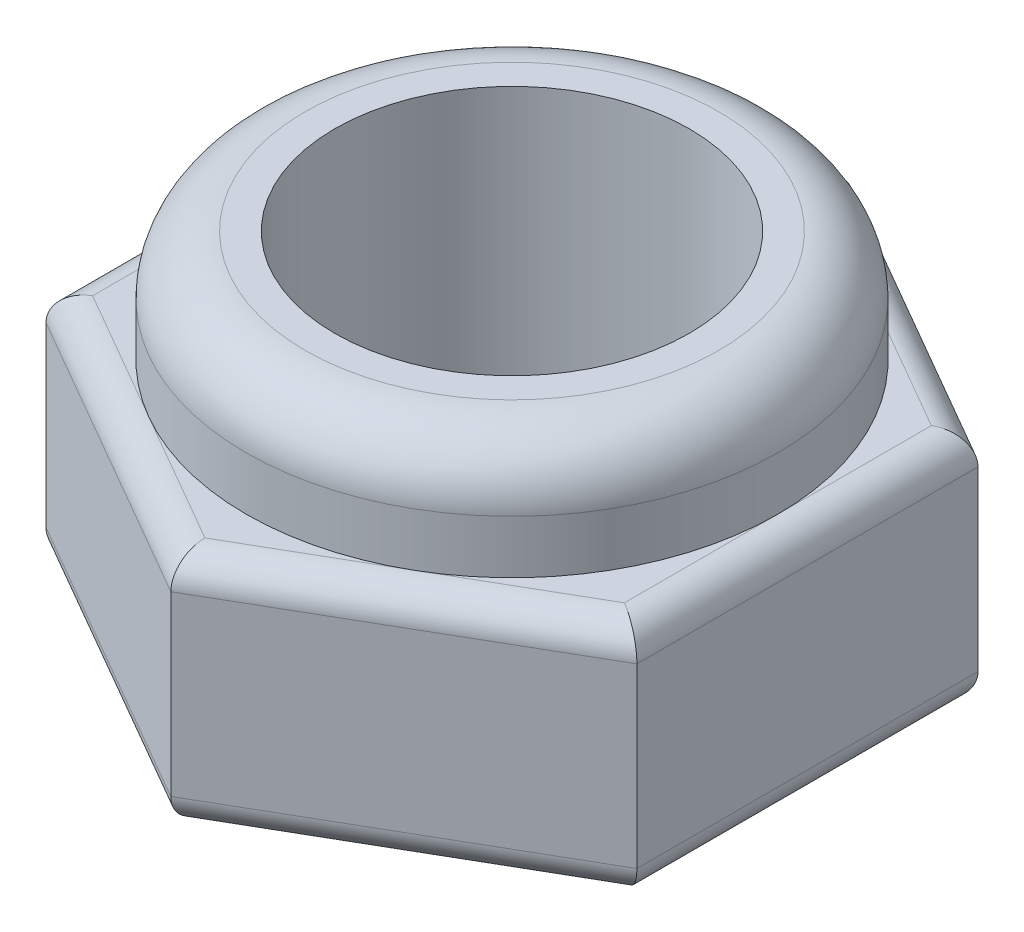
ISO-10303-21;
HEADER;
FILE_DESCRIPTION(('STEP AP214'),'2;1');
FILE_NAME('part.step','',(''),(''),'','','');
FILE_SCHEMA(('AUTOMOTIVE_DESIGN { 1 0 10303 214 1 1 1 1 }'));
ENDSEC;
DATA;
#1=APPLICATION_CONTEXT('core data for automotive mechanical design processes');
#2=APPLICATION_PROTOCOL_DEFINITION('international standard','automotive_design',2000,#1);
#3=PRODUCT_CONTEXT('',#1,'mechanical');
#4=PRODUCT('Part','Part','',(#3));
#5=PRODUCT_RELATED_PRODUCT_CATEGORY('part','',(#4));
#6=PRODUCT_DEFINITION_FORMATION('','',#4);
#7=PRODUCT_DEFINITION_CONTEXT('part definition',#1,'design');
#8=PRODUCT_DEFINITION('design','',#6,#7);
#9=PRODUCT_DEFINITION_SHAPE('','',#8);
#10=(LENGTH_UNIT() NAMED_UNIT(*) SI_UNIT(.MILLI.,.METRE.));
#11=(NAMED_UNIT(*) PLANE_ANGLE_UNIT() SI_UNIT($,.RADIAN.));
#12=(NAMED_UNIT(*) SI_UNIT($,.STERADIAN.) SOLID_ANGLE_UNIT());
#13=UNCERTAINTY_MEASURE_WITH_UNIT(LENGTH_MEASURE(1.E-05),#10,'distance_accuracy_value','');
#14=(GEOMETRIC_REPRESENTATION_CONTEXT(3) GLOBAL_UNCERTAINTY_ASSIGNED_CONTEXT((#13)) GLOBAL_UNIT_ASSIGNED_CONTEXT((#10,
#11,#12)) REPRESENTATION_CONTEXT('',''));
#15=CARTESIAN_POINT('',(0.,0.,0.));
#16=DIRECTION('',(0.,0.,1.));
#17=DIRECTION('',(1.,0.,0.));
#18=AXIS2_PLACEMENT_3D('',#15,#16,#17);
#19=CARTESIAN_POINT('',(0.,4.,0.));
#20=DIRECTION('',(0.,1.,0.));
#21=DIRECTION('',(0.,0.,1.));
#22=AXIS2_PLACEMENT_3D('',#19,#20,#21);
#23=PLANE('',#22);
#24=DIRECTION('',(0.866025403784438,0.,-0.500000000000001));
#25=VECTOR('',#24,1.);
#26=CARTESIAN_POINT('',(4.75000000000001,4.,2.4537386440559));
#27=LINE('',#26,#25);
#28=CARTESIAN_POINT('',(2.25000000000001,4.,3.89711431702997));
#29=VERTEX_POINT('',#28);
#30=CARTESIAN_POINT('',(4.50000000000001,4.,2.59807621135331));
#31=VERTEX_POINT('',#30);
#32=EDGE_CURVE('E55',#29,#31,#27,.T.);
#33=ORIENTED_EDGE('',*,*,#32,.T.);
#34=DIRECTION('',(0.,0.,-1.));
#35=VECTOR('',#34,1.);
#36=CARTESIAN_POINT('',(4.49999999999999,4.,-2.88675134594815));
#37=LINE('',#36,#35);
#38=CARTESIAN_POINT('',(4.5,4.,0.));
#39=VERTEX_POINT('',#38);
#40=EDGE_CURVE('E11',#31,#39,#37,.T.);
#41=ORIENTED_EDGE('',*,*,#40,.T.);
#42=CARTESIAN_POINT('',(0.,4.,0.));
#43=DIRECTION('',(0.,1.,0.));
#44=DIRECTION('',(0.,0.,1.));
#45=AXIS2_PLACEMENT_3D('',#42,#43,#44);
#46=CIRCLE('',#45,4.5);
#47=EDGE_CURVE('E269',#29,#39,#46,.T.);
#48=ORIENTED_EDGE('',*,*,#47,.F.);
#49=EDGE_LOOP('',(#33,#41,#48));
#50=FACE_BOUND('',#49,.T.);
#51=ADVANCED_FACE('F39',(#50),#23,.T.);
#52=CARTESIAN_POINT('',(2.24999999999998,4.,-3.89711431702999));
#53=VERTEX_POINT('',#52);
#54=EDGE_CURVE('E285',#39,#53,#46,.T.);
#55=ORIENTED_EDGE('',*,*,#54,.F.);
#56=DIRECTION('',(0.,0.,-1.));
#57=VECTOR('',#56,1.);
#58=CARTESIAN_POINT('',(4.49999999999999,4.,-2.88675134594815));
#59=LINE('',#58,#57);
#60=CARTESIAN_POINT('',(4.49999999999999,4.,-2.59807621135334));
#61=VERTEX_POINT('',#60);
#62=EDGE_CURVE('E48',#39,#61,#59,.T.);
#63=ORIENTED_EDGE('',*,*,#62,.T.);
#64=DIRECTION('',(-0.866025403784442,0.,-0.499999999999995));
#65=VECTOR('',#64,1.);
#66=CARTESIAN_POINT('',(-0.250000000000038,4.,-5.34048999000404));
#67=LINE('',#66,#65);
#68=EDGE_CURVE('E214',#61,#53,#67,.T.);
#69=ORIENTED_EDGE('',*,*,#68,.T.);
#70=EDGE_LOOP('',(#55,#63,#69));
#71=FACE_BOUND('',#70,.T.);
#72=ADVANCED_FACE('F309',(#71),#23,.T.);
#73=CARTESIAN_POINT('',(-2.25000000000003,4.,-3.89711431702996));
#74=VERTEX_POINT('',#73);
#75=EDGE_CURVE('E349',#53,#74,#46,.T.);
#76=ORIENTED_EDGE('',*,*,#75,.F.);
#77=DIRECTION('',(-0.866025403784442,0.,-0.499999999999995));
#78=VECTOR('',#77,1.);
#79=CARTESIAN_POINT('',(-0.250000000000038,4.,-5.34048999000404));
#80=LINE('',#79,#78);
#81=CARTESIAN_POINT('',(0.,4.,-5.19615242270664));
#82=VERTEX_POINT('',#81);
#83=EDGE_CURVE('E216',#53,#82,#80,.T.);
#84=ORIENTED_EDGE('',*,*,#83,.T.);
#85=DIRECTION('',(-0.866025403784435,0.,0.500000000000007));
#86=VECTOR('',#85,1.);
#87=CARTESIAN_POINT('',(-4.75000000000003,4.,-2.45373864405587));
#88=LINE('',#87,#86);
#89=EDGE_CURVE('E222',#82,#74,#88,.T.);
#90=ORIENTED_EDGE('',*,*,#89,.T.);
#91=EDGE_LOOP('',(#76,#84,#90));
#92=FACE_BOUND('',#91,.T.);
#93=ADVANCED_FACE('F315',(#92),#23,.T.);
#94=DIRECTION('',(0.866025403784442,0.,0.499999999999995));
#95=VECTOR('',#94,1.);
#96=CARTESIAN_POINT('',(0.249999999999999,4.,5.34048999000404));
#97=LINE('',#96,#95);
#98=CARTESIAN_POINT('',(-2.24999999999999,4.,3.89711431703001));
#99=VERTEX_POINT('',#98);
#100=CARTESIAN_POINT('',(0.,4.,5.19615242270664));
#101=VERTEX_POINT('',#100);
#102=EDGE_CURVE('E220',#99,#101,#97,.T.);
#103=ORIENTED_EDGE('',*,*,#102,.T.);
#104=DIRECTION('',(0.866025403784438,0.,-0.500000000000001));
#105=VECTOR('',#104,1.);
#106=CARTESIAN_POINT('',(4.75000000000001,4.,2.4537386440559));
#107=LINE('',#106,#105);
#108=EDGE_CURVE('E218',#101,#29,#107,.T.);
#109=ORIENTED_EDGE('',*,*,#108,.T.);
#110=EDGE_CURVE('E270',#99,#29,#46,.T.);
#111=ORIENTED_EDGE('',*,*,#110,.F.);
#112=EDGE_LOOP('',(#103,#109,#111));
#113=FACE_BOUND('',#112,.T.);
#114=ADVANCED_FACE('F331',(#113),#23,.T.);
#115=CARTESIAN_POINT('',(-4.5,4.,0.));
#116=VERTEX_POINT('',#115);
#117=EDGE_CURVE('E342',#74,#116,#46,.T.);
#118=ORIENTED_EDGE('',*,*,#117,.F.);
#119=DIRECTION('',(-0.866025403784435,0.,0.500000000000007));
#120=VECTOR('',#119,1.);
#121=CARTESIAN_POINT('',(-4.75000000000003,4.,-2.45373864405587));
#122=LINE('',#121,#120);
#123=CARTESIAN_POINT('',(-4.50000000000003,4.,-2.59807621135328));
#124=VERTEX_POINT('',#123);
#125=EDGE_CURVE('E225',#74,#124,#122,.T.);
#126=ORIENTED_EDGE('',*,*,#125,.T.);
#127=DIRECTION('',(0.,0.,1.));
#128=VECTOR('',#127,1.);
#129=CARTESIAN_POINT('',(-4.49999999999997,4.,2.88675134594818));
#130=LINE('',#129,#128);
#131=EDGE_CURVE('E229',#124,#116,#130,.T.);
#132=ORIENTED_EDGE('',*,*,#131,.T.);
#133=EDGE_LOOP('',(#118,#126,#132));
#134=FACE_BOUND('',#133,.T.);
#135=ADVANCED_FACE('F320',(#134),#23,.T.);
#136=CARTESIAN_POINT('',(-4.99999999999997,4.,2.88675134594819));
#137=DIRECTION('',(0.499999999999995,0.,-0.866025403784441));
#138=DIRECTION('',(-0.866025403784442,0.,-0.499999999999995));
#139=AXIS2_PLACEMENT_3D('',#136,#137,#138);
#140=PLANE('',#139);
#141=DIRECTION('',(0.,-1.,0.));
#142=VECTOR('',#141,1.);
#143=CARTESIAN_POINT('',(-4.99999999999997,4.,2.88675134594819));
#144=LINE('',#143,#142);
#145=CARTESIAN_POINT('',(-4.99999999999997,3.5,2.88675134594819));
#146=VERTEX_POINT('',#145);
#147=CARTESIAN_POINT('',(-4.99999999999997,0.5,2.88675134594819));
#148=VERTEX_POINT('',#147);
#149=EDGE_CURVE('E279',#146,#148,#144,.T.);
#150=ORIENTED_EDGE('',*,*,#149,.T.);
#151=DIRECTION('',(0.866025403784442,0.,0.499999999999995));
#152=VECTOR('',#151,1.);
#153=CARTESIAN_POINT('',(-4.99999999999997,0.5,2.88675134594819));
#154=LINE('',#153,#152);
#155=CARTESIAN_POINT('',(0.,0.5,5.77350269189626));
#156=VERTEX_POINT('',#155);
#157=EDGE_CURVE('E233',#148,#156,#154,.T.);
#158=ORIENTED_EDGE('',*,*,#157,.T.);
#159=DIRECTION('',(0.,-1.,0.));
#160=VECTOR('',#159,1.);
#161=CARTESIAN_POINT('',(0.,4.,5.77350269189626));
#162=LINE('',#161,#160);
#163=CARTESIAN_POINT('',(0.,3.5,5.77350269189626));
#164=VERTEX_POINT('',#163);
#165=EDGE_CURVE('E170',#164,#156,#162,.T.);
#166=ORIENTED_EDGE('',*,*,#165,.F.);
#167=DIRECTION('',(0.866025403784442,0.,0.499999999999995));
#168=VECTOR('',#167,1.);
#169=CARTESIAN_POINT('',(-4.99999999999997,3.5,2.88675134594819));
#170=LINE('',#169,#168);
#171=EDGE_CURVE('E235',#164,#146,#170,.F.);
#172=ORIENTED_EDGE('',*,*,#171,.T.);
#173=EDGE_LOOP('',(#150,#158,#166,#172));
#174=FACE_BOUND('',#173,.T.);
#175=ADVANCED_FACE('F330',(#174),#140,.F.);
#176=CARTESIAN_POINT('',(0.,4.,5.77350269189626));
#177=DIRECTION('',(-0.500000000000001,0.,-0.866025403784438));
#178=DIRECTION('',(-0.866025403784438,0.,0.500000000000001));
#179=AXIS2_PLACEMENT_3D('',#176,#177,#178);
#180=PLANE('',#179);
#181=ORIENTED_EDGE('',*,*,#165,.T.);
#182=DIRECTION('',(0.866025403784438,0.,-0.500000000000001));
#183=VECTOR('',#182,1.);
#184=CARTESIAN_POINT('',(0.,0.5,5.77350269189626));
#185=LINE('',#184,#183);
#186=CARTESIAN_POINT('',(5.00000000000001,0.5,2.88675134594812));
#187=VERTEX_POINT('',#186);
#188=EDGE_CURVE('E169',#156,#187,#185,.T.);
#189=ORIENTED_EDGE('',*,*,#188,.T.);
#190=DIRECTION('',(0.,-1.,0.));
#191=VECTOR('',#190,1.);
#192=CARTESIAN_POINT('',(5.00000000000001,4.,2.88675134594812));
#193=LINE('',#192,#191);
#194=CARTESIAN_POINT('',(5.00000000000001,3.5,2.88675134594812));
#195=VERTEX_POINT('',#194);
#196=EDGE_CURVE('E152',#195,#187,#193,.T.);
#197=ORIENTED_EDGE('',*,*,#196,.F.);
#198=DIRECTION('',(0.866025403784438,0.,-0.500000000000001));
#199=VECTOR('',#198,1.);
#200=CARTESIAN_POINT('',(0.,3.5,5.77350269189626));
#201=LINE('',#200,#199);
#202=EDGE_CURVE('E166',#195,#164,#201,.F.);
#203=ORIENTED_EDGE('',*,*,#202,.T.);
#204=EDGE_LOOP('',(#181,#189,#197,#203));
#205=FACE_BOUND('',#204,.T.);
#206=ADVANCED_FACE('F165',(#205),#180,.F.);
#207=CARTESIAN_POINT('',(5.00000000000001,4.,2.88675134594812));
#208=DIRECTION('',(-1.,0.,0.));
#209=DIRECTION('',(0.,0.,1.));
#210=AXIS2_PLACEMENT_3D('',#207,#208,#209);
#211=PLANE('',#210);
#212=ORIENTED_EDGE('',*,*,#196,.T.);
#213=DIRECTION('',(0.,0.,-1.));
#214=VECTOR('',#213,1.);
#215=CARTESIAN_POINT('',(5.00000000000001,0.5,2.88675134594812));
#216=LINE('',#215,#214);
#217=CARTESIAN_POINT('',(4.99999999999999,0.5,-2.88675134594815));
#218=VERTEX_POINT('',#217);
#219=EDGE_CURVE('E158',#187,#218,#216,.T.);
#220=ORIENTED_EDGE('',*,*,#219,.T.);
#221=DIRECTION('',(0.,-1.,0.));
#222=VECTOR('',#221,1.);
#223=CARTESIAN_POINT('',(4.99999999999999,4.,-2.88675134594815));
#224=LINE('',#223,#222);
#225=CARTESIAN_POINT('',(4.99999999999999,3.5,-2.88675134594815));
#226=VERTEX_POINT('',#225);
#227=EDGE_CURVE('E154',#226,#218,#224,.T.);
#228=ORIENTED_EDGE('',*,*,#227,.F.);
#229=DIRECTION('',(0.,0.,-1.));
#230=VECTOR('',#229,1.);
#231=CARTESIAN_POINT('',(5.00000000000001,3.5,2.88675134594812));
#232=LINE('',#231,#230);
#233=EDGE_CURVE('E149',#226,#195,#232,.F.);
#234=ORIENTED_EDGE('',*,*,#233,.T.);
#235=EDGE_LOOP('',(#212,#220,#228,#234));
#236=FACE_BOUND('',#235,.T.);
#237=ADVANCED_FACE('F151',(#236),#211,.F.);
#238=CARTESIAN_POINT('',(4.99999999999999,4.,-2.88675134594815));
#239=DIRECTION('',(-0.499999999999995,0.,0.866025403784442));
#240=DIRECTION('',(0.866025403784442,0.,0.499999999999995));
#241=AXIS2_PLACEMENT_3D('',#238,#239,#240);
#242=PLANE('',#241);
#243=ORIENTED_EDGE('',*,*,#227,.T.);
#244=DIRECTION('',(-0.866025403784442,0.,-0.499999999999995));
#245=VECTOR('',#244,1.);
#246=CARTESIAN_POINT('',(4.99999999999999,0.5,-2.88675134594815));
#247=LINE('',#246,#245);
#248=CARTESIAN_POINT('',(0.,0.5,-5.77350269189626));
#249=VERTEX_POINT('',#248);
#250=EDGE_CURVE('E246',#218,#249,#247,.T.);
#251=ORIENTED_EDGE('',*,*,#250,.T.);
#252=DIRECTION('',(0.,-1.,0.));
#253=VECTOR('',#252,1.);
#254=CARTESIAN_POINT('',(0.,4.,-5.77350269189626));
#255=LINE('',#254,#253);
#256=CARTESIAN_POINT('',(0.,3.5,-5.77350269189626));
#257=VERTEX_POINT('',#256);
#258=EDGE_CURVE('E273',#257,#249,#255,.T.);
#259=ORIENTED_EDGE('',*,*,#258,.F.);
#260=DIRECTION('',(-0.866025403784442,0.,-0.499999999999995));
#261=VECTOR('',#260,1.);
#262=CARTESIAN_POINT('',(4.99999999999999,3.5,-2.88675134594815));
#263=LINE('',#262,#261);
#264=EDGE_CURVE('E248',#257,#226,#263,.F.);
#265=ORIENTED_EDGE('',*,*,#264,.T.);
#266=EDGE_LOOP('',(#243,#251,#259,#265));
#267=FACE_BOUND('',#266,.T.);
#268=ADVANCED_FACE('F378',(#267),#242,.F.);
#269=CARTESIAN_POINT('',(0.,4.,-5.77350269189626));
#270=DIRECTION('',(0.500000000000007,0.,0.866025403784435));
#271=DIRECTION('',(0.866025403784435,0.,-0.500000000000007));
#272=AXIS2_PLACEMENT_3D('',#269,#270,#271);
#273=PLANE('',#272);
#274=ORIENTED_EDGE('',*,*,#258,.T.);
#275=DIRECTION('',(-0.866025403784435,0.,0.500000000000007));
#276=VECTOR('',#275,1.);
#277=CARTESIAN_POINT('',(0.,0.5,-5.77350269189626));
#278=LINE('',#277,#276);
#279=CARTESIAN_POINT('',(-5.00000000000003,0.5,-2.88675134594808));
#280=VERTEX_POINT('',#279);
#281=EDGE_CURVE('E241',#249,#280,#278,.T.);
#282=ORIENTED_EDGE('',*,*,#281,.T.);
#283=DIRECTION('',(0.,-1.,0.));
#284=VECTOR('',#283,1.);
#285=CARTESIAN_POINT('',(-5.00000000000003,4.,-2.88675134594808));
#286=LINE('',#285,#284);
#287=CARTESIAN_POINT('',(-5.00000000000003,3.5,-2.88675134594808));
#288=VERTEX_POINT('',#287);
#289=EDGE_CURVE('E276',#288,#280,#286,.T.);
#290=ORIENTED_EDGE('',*,*,#289,.F.);
#291=DIRECTION('',(-0.866025403784435,0.,0.500000000000007));
#292=VECTOR('',#291,1.);
#293=CARTESIAN_POINT('',(0.,3.5,-5.77350269189626));
#294=LINE('',#293,#292);
#295=EDGE_CURVE('E243',#288,#257,#294,.F.);
#296=ORIENTED_EDGE('',*,*,#295,.T.);
#297=EDGE_LOOP('',(#274,#282,#290,#296));
#298=FACE_BOUND('',#297,.T.);
#299=ADVANCED_FACE('F326',(#298),#273,.F.);
#300=CARTESIAN_POINT('',(-5.00000000000003,4.,-2.88675134594808));
#301=DIRECTION('',(1.,0.,0.));
#302=DIRECTION('',(0.,0.,-1.));
#303=AXIS2_PLACEMENT_3D('',#300,#301,#302);
#304=PLANE('',#303);
#305=ORIENTED_EDGE('',*,*,#289,.T.);
#306=DIRECTION('',(0.,0.,1.));
#307=VECTOR('',#306,1.);
#308=CARTESIAN_POINT('',(-5.00000000000003,0.5,-2.88675134594808));
#309=LINE('',#308,#307);
#310=EDGE_CURVE('E237',#280,#148,#309,.T.);
#311=ORIENTED_EDGE('',*,*,#310,.T.);
#312=ORIENTED_EDGE('',*,*,#149,.F.);
#313=DIRECTION('',(0.,0.,1.));
#314=VECTOR('',#313,1.);
#315=CARTESIAN_POINT('',(-5.00000000000003,3.5,-2.88675134594808));
#316=LINE('',#315,#314);
#317=EDGE_CURVE('E239',#146,#288,#316,.F.);
#318=ORIENTED_EDGE('',*,*,#317,.T.);
#319=EDGE_LOOP('',(#305,#311,#312,#318));
#320=FACE_BOUND('',#319,.T.);
#321=ADVANCED_FACE('F318',(#320),#304,.F.);
#322=DIRECTION('',(0.,0.,1.));
#323=VECTOR('',#322,1.);
#324=CARTESIAN_POINT('',(-4.49999999999997,4.,2.88675134594818));
#325=LINE('',#324,#323);
#326=CARTESIAN_POINT('',(-4.49999999999997,4.,2.59807621135337));
#327=VERTEX_POINT('',#326);
#328=EDGE_CURVE('E231',#116,#327,#325,.T.);
#329=ORIENTED_EDGE('',*,*,#328,.T.);
#330=DIRECTION('',(0.866025403784442,0.,0.499999999999995));
#331=VECTOR('',#330,1.);
#332=CARTESIAN_POINT('',(0.249999999999999,4.,5.34048999000404));
#333=LINE('',#332,#331);
#334=EDGE_CURVE('E227',#327,#99,#333,.T.);
#335=ORIENTED_EDGE('',*,*,#334,.T.);
#336=EDGE_CURVE('E350',#116,#99,#46,.T.);
#337=ORIENTED_EDGE('',*,*,#336,.F.);
#338=EDGE_LOOP('',(#329,#335,#337));
#339=FACE_BOUND('',#338,.T.);
#340=ADVANCED_FACE('F311',(#339),#23,.T.);
#341=CARTESIAN_POINT('',(0.,0.,0.));
#342=DIRECTION('',(0.,1.,0.));
#343=DIRECTION('',(0.,0.,1.));
#344=AXIS2_PLACEMENT_3D('',#341,#342,#343);
#345=PLANE('',#344);
#346=DIRECTION('',(0.,0.,-1.));
#347=VECTOR('',#346,1.);
#348=CARTESIAN_POINT('',(4.5,0.,0.));
#349=LINE('',#348,#347);
#350=CARTESIAN_POINT('',(4.49999999999999,0.,-2.59807621135334));
#351=VERTEX_POINT('',#350);
#352=CARTESIAN_POINT('',(4.50000000000001,0.,2.59807621135331));
#353=VERTEX_POINT('',#352);
#354=EDGE_CURVE('E253',#351,#353,#349,.F.);
#355=ORIENTED_EDGE('',*,*,#354,.T.);
#356=DIRECTION('',(0.866025403784438,0.,-0.500000000000001));
#357=VECTOR('',#356,1.);
#358=CARTESIAN_POINT('',(2.25000000000001,0.,3.89711431702997));
#359=LINE('',#358,#357);
#360=CARTESIAN_POINT('',(0.,0.,5.19615242270664));
#361=VERTEX_POINT('',#360);
#362=EDGE_CURVE('E159',#353,#361,#359,.F.);
#363=ORIENTED_EDGE('',*,*,#362,.T.);
#364=DIRECTION('',(0.866025403784442,0.,0.499999999999995));
#365=VECTOR('',#364,1.);
#366=CARTESIAN_POINT('',(-2.24999999999999,0.,3.89711431703001));
#367=LINE('',#366,#365);
#368=CARTESIAN_POINT('',(-4.49999999999997,0.,2.59807621135337));
#369=VERTEX_POINT('',#368);
#370=EDGE_CURVE('E261',#361,#369,#367,.F.);
#371=ORIENTED_EDGE('',*,*,#370,.T.);
#372=DIRECTION('',(0.,0.,1.));
#373=VECTOR('',#372,1.);
#374=CARTESIAN_POINT('',(-4.5,0.,0.));
#375=LINE('',#374,#373);
#376=CARTESIAN_POINT('',(-4.50000000000003,0.,-2.59807621135328));
#377=VERTEX_POINT('',#376);
#378=EDGE_CURVE('E259',#369,#377,#375,.F.);
#379=ORIENTED_EDGE('',*,*,#378,.T.);
#380=DIRECTION('',(-0.866025403784435,0.,0.500000000000007));
#381=VECTOR('',#380,1.);
#382=CARTESIAN_POINT('',(-2.25000000000003,0.,-3.89711431702996));
#383=LINE('',#382,#381);
#384=CARTESIAN_POINT('',(0.,0.,-5.19615242270664));
#385=VERTEX_POINT('',#384);
#386=EDGE_CURVE('E257',#377,#385,#383,.F.);
#387=ORIENTED_EDGE('',*,*,#386,.T.);
#388=DIRECTION('',(-0.866025403784442,0.,-0.499999999999995));
#389=VECTOR('',#388,1.);
#390=CARTESIAN_POINT('',(2.24999999999998,0.,-3.89711431702999));
#391=LINE('',#390,#389);
#392=EDGE_CURVE('E255',#385,#351,#391,.F.);
#393=ORIENTED_EDGE('',*,*,#392,.T.);
#394=EDGE_LOOP('',(#355,#363,#371,#379,#387,#393));
#395=FACE_BOUND('',#394,.T.);
#396=CARTESIAN_POINT('',(0.,0.,0.));
#397=DIRECTION('',(0.,1.,0.));
#398=DIRECTION('',(0.,0.,1.));
#399=AXIS2_PLACEMENT_3D('',#396,#397,#398);
#400=CIRCLE('',#399,3.);
#401=CARTESIAN_POINT('',(0.,0.,3.));
#402=VERTEX_POINT('',#401);
#403=EDGE_CURVE('E282',#402,#402,#400,.T.);
#404=ORIENTED_EDGE('',*,*,#403,.T.);
#405=EDGE_LOOP('',(#404));
#406=FACE_BOUND('',#405,.T.);
#407=ADVANCED_FACE('F305',(#395,#406),#345,.F.);
#408=CARTESIAN_POINT('',(0.,5.9,0.));
#409=DIRECTION('',(0.,-1.,0.));
#410=DIRECTION('',(0.,0.,-1.));
#411=AXIS2_PLACEMENT_3D('',#408,#409,#410);
#412=CYLINDRICAL_SURFACE('',#411,4.5);
#413=CARTESIAN_POINT('',(0.,4.9,0.));
#414=DIRECTION('',(0.,1.,0.));
#415=DIRECTION('',(0.,0.,1.));
#416=AXIS2_PLACEMENT_3D('',#413,#414,#415);
#417=CIRCLE('',#416,4.5);
#418=CARTESIAN_POINT('',(0.,4.9,4.5));
#419=VERTEX_POINT('',#418);
#420=EDGE_CURVE('E179',#419,#419,#417,.F.);
#421=ORIENTED_EDGE('',*,*,#420,.T.);
#422=EDGE_LOOP('',(#421));
#423=FACE_BOUND('',#422,.T.);
#424=ORIENTED_EDGE('',*,*,#47,.T.);
#425=ORIENTED_EDGE('',*,*,#54,.T.);
#426=ORIENTED_EDGE('',*,*,#75,.T.);
#427=ORIENTED_EDGE('',*,*,#117,.T.);
#428=ORIENTED_EDGE('',*,*,#336,.T.);
#429=ORIENTED_EDGE('',*,*,#110,.T.);
#430=EDGE_LOOP('',(#424,#425,#426,#427,#428,#429));
#431=FACE_BOUND('',#430,.T.);
#432=ADVANCED_FACE('F296',(#423,#431),#412,.T.);
#433=CARTESIAN_POINT('',(0.,5.9,0.));
#434=DIRECTION('',(0.,1.,0.));
#435=DIRECTION('',(0.,0.,1.));
#436=AXIS2_PLACEMENT_3D('',#433,#434,#435);
#437=PLANE('',#436);
#438=CARTESIAN_POINT('',(0.,5.9,0.));
#439=DIRECTION('',(0.,1.,0.));
#440=DIRECTION('',(0.,0.,1.));
#441=AXIS2_PLACEMENT_3D('',#438,#439,#440);
#442=CIRCLE('',#441,3.5);
#443=CARTESIAN_POINT('',(0.,5.9,3.5));
#444=VERTEX_POINT('',#443);
#445=EDGE_CURVE('E266',#444,#444,#442,.T.);
#446=ORIENTED_EDGE('',*,*,#445,.T.);
#447=EDGE_LOOP('',(#446));
#448=FACE_BOUND('',#447,.T.);
#449=CARTESIAN_POINT('',(0.,5.9,0.));
#450=DIRECTION('',(0.,1.,0.));
#451=DIRECTION('',(0.,0.,1.));
#452=AXIS2_PLACEMENT_3D('',#449,#450,#451);
#453=CIRCLE('',#452,3.);
#454=CARTESIAN_POINT('',(0.,5.9,3.));
#455=VERTEX_POINT('',#454);
#456=EDGE_CURVE('E201',#455,#455,#453,.T.);
#457=ORIENTED_EDGE('',*,*,#456,.F.);
#458=EDGE_LOOP('',(#457));
#459=FACE_BOUND('',#458,.T.);
#460=ADVANCED_FACE('F294',(#448,#459),#437,.T.);
#461=CARTESIAN_POINT('',(0.,-14.1,0.));
#462=DIRECTION('',(0.,1.,0.));
#463=DIRECTION('',(0.,0.,1.));
#464=AXIS2_PLACEMENT_3D('',#461,#462,#463);
#465=CYLINDRICAL_SURFACE('',#464,3.);
#466=ORIENTED_EDGE('',*,*,#456,.T.);
#467=EDGE_LOOP('',(#466));
#468=FACE_BOUND('',#467,.T.);
#469=ORIENTED_EDGE('',*,*,#403,.F.);
#470=EDGE_LOOP('',(#469));
#471=FACE_BOUND('',#470,.T.);
#472=ADVANCED_FACE('F291',(#468,#471),#465,.F.);
#473=CARTESIAN_POINT('',(0.,4.9,0.));
#474=DIRECTION('',(0.,1.,0.));
#475=DIRECTION('',(0.,0.,1.));
#476=AXIS2_PLACEMENT_3D('',#473,#474,#475);
#477=TOROIDAL_SURFACE('',#476,3.5,1.);
#478=ORIENTED_EDGE('',*,*,#420,.F.);
#479=EDGE_LOOP('',(#478));
#480=FACE_BOUND('',#479,.T.);
#481=ORIENTED_EDGE('',*,*,#445,.F.);
#482=EDGE_LOOP('',(#481));
#483=FACE_BOUND('',#482,.T.);
#484=ADVANCED_FACE('F303',(#480,#483),#477,.T.);
#485=CARTESIAN_POINT('',(0.249999999999963,0.5,-5.34048999000405));
#486=DIRECTION('',(-0.866025403784435,0.,0.500000000000007));
#487=DIRECTION('',(0.500000000000007,0.,0.866025403784435));
#488=AXIS2_PLACEMENT_3D('',#485,#486,#487);
#489=CYLINDRICAL_SURFACE('',#488,0.5);
#490=CARTESIAN_POINT('',(0.,0.5,-5.19615242270664));
#491=DIRECTION('',(-1.,0.,0.));
#492=DIRECTION('',(0.,0.,1.));
#493=AXIS2_PLACEMENT_3D('',#490,#491,#492);
#494=ELLIPSE('',#493,0.577350269189626,0.5);
#495=EDGE_CURVE('E202',#385,#249,#494,.F.);
#496=ORIENTED_EDGE('',*,*,#495,.F.);
#497=ORIENTED_EDGE('',*,*,#386,.F.);
#498=CARTESIAN_POINT('',(-4.50000000000003,0.5,-2.59807621135328));
#499=DIRECTION('',(-0.499999999999992,0.,0.866025403784443));
#500=DIRECTION('',(0.866025403784443,0.,0.499999999999992));
#501=AXIS2_PLACEMENT_3D('',#498,#499,#500);
#502=ELLIPSE('',#501,0.577350269189626,0.5);
#503=EDGE_CURVE('E198',#280,#377,#502,.T.);
#504=ORIENTED_EDGE('',*,*,#503,.F.);
#505=ORIENTED_EDGE('',*,*,#281,.F.);
#506=EDGE_LOOP('',(#496,#497,#504,#505));
#507=FACE_BOUND('',#506,.T.);
#508=ADVANCED_FACE('F407',(#507),#489,.T.);
#509=CARTESIAN_POINT('',(-4.50000000000003,0.5,-2.88675134594809));
#510=DIRECTION('',(0.,0.,1.));
#511=DIRECTION('',(1.,0.,0.));
#512=AXIS2_PLACEMENT_3D('',#509,#510,#511);
#513=CYLINDRICAL_SURFACE('',#512,0.5);
#514=ORIENTED_EDGE('',*,*,#503,.T.);
#515=ORIENTED_EDGE('',*,*,#378,.F.);
#516=CARTESIAN_POINT('',(-4.49999999999997,0.5,2.59807621135337));
#517=DIRECTION('',(0.500000000000007,0.,0.866025403784435));
#518=DIRECTION('',(0.866025403784435,0.,-0.500000000000007));
#519=AXIS2_PLACEMENT_3D('',#516,#517,#518);
#520=ELLIPSE('',#519,0.577350269189625,0.5);
#521=EDGE_CURVE('E205',#148,#369,#520,.T.);
#522=ORIENTED_EDGE('',*,*,#521,.F.);
#523=ORIENTED_EDGE('',*,*,#310,.F.);
#524=EDGE_LOOP('',(#514,#515,#522,#523));
#525=FACE_BOUND('',#524,.T.);
#526=ADVANCED_FACE('F403',(#525),#513,.T.);
#527=CARTESIAN_POINT('',(4.74999999999999,0.5,-2.45373864405593));
#528=DIRECTION('',(-0.866025403784442,0.,-0.499999999999995));
#529=DIRECTION('',(-0.499999999999995,0.,0.866025403784442));
#530=AXIS2_PLACEMENT_3D('',#527,#528,#529);
#531=CYLINDRICAL_SURFACE('',#530,0.5);
#532=ORIENTED_EDGE('',*,*,#495,.T.);
#533=ORIENTED_EDGE('',*,*,#250,.F.);
#534=CARTESIAN_POINT('',(4.49999999999999,0.5,-2.59807621135334));
#535=DIRECTION('',(-0.500000000000004,0.,-0.866025403784436));
#536=DIRECTION('',(-0.866025403784436,0.,0.500000000000004));
#537=AXIS2_PLACEMENT_3D('',#534,#535,#536);
#538=ELLIPSE('',#537,0.577350269189626,0.5);
#539=EDGE_CURVE('E208',#351,#218,#538,.F.);
#540=ORIENTED_EDGE('',*,*,#539,.F.);
#541=ORIENTED_EDGE('',*,*,#392,.F.);
#542=EDGE_LOOP('',(#532,#533,#540,#541));
#543=FACE_BOUND('',#542,.T.);
#544=ADVANCED_FACE('F382',(#543),#531,.T.);
#545=CARTESIAN_POINT('',(-4.74999999999997,0.5,2.45373864405597));
#546=DIRECTION('',(0.866025403784442,0.,0.499999999999995));
#547=DIRECTION('',(0.499999999999995,0.,-0.866025403784441));
#548=AXIS2_PLACEMENT_3D('',#545,#546,#547);
#549=CYLINDRICAL_SURFACE('',#548,0.5);
#550=ORIENTED_EDGE('',*,*,#521,.T.);
#551=ORIENTED_EDGE('',*,*,#370,.F.);
#552=CARTESIAN_POINT('',(0.,0.5,5.19615242270664));
#553=DIRECTION('',(1.,0.,0.));
#554=DIRECTION('',(0.,0.,1.));
#555=AXIS2_PLACEMENT_3D('',#552,#553,#554);
#556=ELLIPSE('',#555,0.577350269189625,0.5);
#557=EDGE_CURVE('E183',#156,#361,#556,.T.);
#558=ORIENTED_EDGE('',*,*,#557,.F.);
#559=ORIENTED_EDGE('',*,*,#157,.F.);
#560=EDGE_LOOP('',(#550,#551,#558,#559));
#561=FACE_BOUND('',#560,.T.);
#562=ADVANCED_FACE('F398',(#561),#549,.T.);
#563=CARTESIAN_POINT('',(4.50000000000001,0.5,2.88675134594812));
#564=DIRECTION('',(0.,0.,-1.));
#565=DIRECTION('',(-1.,0.,0.));
#566=AXIS2_PLACEMENT_3D('',#563,#564,#565);
#567=CYLINDRICAL_SURFACE('',#566,0.5);
#568=ORIENTED_EDGE('',*,*,#539,.T.);
#569=ORIENTED_EDGE('',*,*,#219,.F.);
#570=CARTESIAN_POINT('',(4.50000000000001,0.5,2.59807621135331));
#571=DIRECTION('',(0.499999999999998,0.,-0.86602540378444));
#572=DIRECTION('',(-0.86602540378444,0.,-0.499999999999998));
#573=AXIS2_PLACEMENT_3D('',#570,#571,#572);
#574=ELLIPSE('',#573,0.577350269189626,0.5);
#575=EDGE_CURVE('E182',#353,#187,#574,.F.);
#576=ORIENTED_EDGE('',*,*,#575,.F.);
#577=ORIENTED_EDGE('',*,*,#354,.F.);
#578=EDGE_LOOP('',(#568,#569,#576,#577));
#579=FACE_BOUND('',#578,.T.);
#580=ADVANCED_FACE('F388',(#579),#567,.T.);
#581=CARTESIAN_POINT('',(-0.25,0.5,5.34048999000404));
#582=DIRECTION('',(0.866025403784438,0.,-0.500000000000001));
#583=DIRECTION('',(-0.500000000000001,0.,-0.866025403784438));
#584=AXIS2_PLACEMENT_3D('',#581,#582,#583);
#585=CYLINDRICAL_SURFACE('',#584,0.5);
#586=ORIENTED_EDGE('',*,*,#557,.T.);
#587=ORIENTED_EDGE('',*,*,#362,.F.);
#588=ORIENTED_EDGE('',*,*,#575,.T.);
#589=ORIENTED_EDGE('',*,*,#188,.F.);
#590=EDGE_LOOP('',(#586,#587,#588,#589));
#591=FACE_BOUND('',#590,.T.);
#592=ADVANCED_FACE('F393',(#591),#585,.T.);
#593=CARTESIAN_POINT('',(2.25000000000001,3.5,3.89711431702997));
#594=DIRECTION('',(-0.866025403784438,0.,0.500000000000001));
#595=DIRECTION('',(0.500000000000001,0.,0.866025403784438));
#596=AXIS2_PLACEMENT_3D('',#593,#594,#595);
#597=CYLINDRICAL_SURFACE('',#596,0.5);
#598=CARTESIAN_POINT('',(0.,3.5,5.19615242270664));
#599=DIRECTION('',(-1.,0.,0.));
#600=DIRECTION('',(0.,0.,-1.));
#601=AXIS2_PLACEMENT_3D('',#598,#599,#600);
#602=ELLIPSE('',#601,0.577350269189625,0.5);
#603=EDGE_CURVE('E177',#164,#101,#602,.T.);
#604=ORIENTED_EDGE('',*,*,#603,.F.);
#605=ORIENTED_EDGE('',*,*,#202,.F.);
#606=CARTESIAN_POINT('',(4.50000000000001,3.5,2.59807621135331));
#607=DIRECTION('',(-0.499999999999998,0.,0.86602540378444));
#608=DIRECTION('',(-0.86602540378444,0.,-0.499999999999998));
#609=AXIS2_PLACEMENT_3D('',#606,#607,#608);
#610=ELLIPSE('',#609,0.577350269189626,0.5);
#611=EDGE_CURVE('E43',#31,#195,#610,.F.);
#612=ORIENTED_EDGE('',*,*,#611,.F.);
#613=ORIENTED_EDGE('',*,*,#32,.F.);
#614=ORIENTED_EDGE('',*,*,#108,.F.);
#615=EDGE_LOOP('',(#604,#605,#612,#613,#614));
#616=FACE_BOUND('',#615,.T.);
#617=ADVANCED_FACE('F41',(#616),#597,.T.);
#618=CARTESIAN_POINT('',(4.5,3.5,0.));
#619=DIRECTION('',(0.,0.,1.));
#620=DIRECTION('',(1.,0.,0.));
#621=AXIS2_PLACEMENT_3D('',#618,#619,#620);
#622=CYLINDRICAL_SURFACE('',#621,0.5);
#623=ORIENTED_EDGE('',*,*,#611,.T.);
#624=ORIENTED_EDGE('',*,*,#233,.F.);
#625=CARTESIAN_POINT('',(4.49999999999999,3.5,-2.59807621135334));
#626=DIRECTION('',(0.500000000000004,0.,0.866025403784436));
#627=DIRECTION('',(-0.866025403784436,0.,0.500000000000004));
#628=AXIS2_PLACEMENT_3D('',#625,#626,#627);
#629=ELLIPSE('',#628,0.577350269189626,0.5);
#630=EDGE_CURVE('E185',#61,#226,#629,.F.);
#631=ORIENTED_EDGE('',*,*,#630,.F.);
#632=ORIENTED_EDGE('',*,*,#62,.F.);
#633=ORIENTED_EDGE('',*,*,#40,.F.);
#634=EDGE_LOOP('',(#623,#624,#631,#632,#633));
#635=FACE_BOUND('',#634,.T.);
#636=ADVANCED_FACE('F181',(#635),#622,.T.);
#637=CARTESIAN_POINT('',(-2.24999999999999,3.5,3.89711431703001));
#638=DIRECTION('',(-0.866025403784442,0.,-0.499999999999995));
#639=DIRECTION('',(-0.499999999999995,0.,0.866025403784441));
#640=AXIS2_PLACEMENT_3D('',#637,#638,#639);
#641=CYLINDRICAL_SURFACE('',#640,0.5);
#642=ORIENTED_EDGE('',*,*,#102,.F.);
#643=ORIENTED_EDGE('',*,*,#334,.F.);
#644=CARTESIAN_POINT('',(-4.49999999999997,3.5,2.59807621135337));
#645=DIRECTION('',(-0.500000000000007,0.,-0.866025403784435));
#646=DIRECTION('',(0.866025403784435,0.,-0.500000000000007));
#647=AXIS2_PLACEMENT_3D('',#644,#645,#646);
#648=ELLIPSE('',#647,0.577350269189625,0.5);
#649=EDGE_CURVE('E188',#146,#327,#648,.T.);
#650=ORIENTED_EDGE('',*,*,#649,.F.);
#651=ORIENTED_EDGE('',*,*,#171,.F.);
#652=ORIENTED_EDGE('',*,*,#603,.T.);
#653=EDGE_LOOP('',(#642,#643,#650,#651,#652));
#654=FACE_BOUND('',#653,.T.);
#655=ADVANCED_FACE('F368',(#654),#641,.T.);
#656=CARTESIAN_POINT('',(2.24999999999998,3.5,-3.89711431702999));
#657=DIRECTION('',(0.866025403784442,0.,0.499999999999995));
#658=DIRECTION('',(0.499999999999995,0.,-0.866025403784442));
#659=AXIS2_PLACEMENT_3D('',#656,#657,#658);
#660=CYLINDRICAL_SURFACE('',#659,0.5);
#661=ORIENTED_EDGE('',*,*,#630,.T.);
#662=ORIENTED_EDGE('',*,*,#264,.F.);
#663=CARTESIAN_POINT('',(0.,3.5,-5.19615242270664));
#664=DIRECTION('',(1.,0.,0.));
#665=DIRECTION('',(0.,0.,1.));
#666=AXIS2_PLACEMENT_3D('',#663,#664,#665);
#667=ELLIPSE('',#666,0.577350269189626,0.5);
#668=EDGE_CURVE('E193',#82,#257,#667,.F.);
#669=ORIENTED_EDGE('',*,*,#668,.F.);
#670=ORIENTED_EDGE('',*,*,#83,.F.);
#671=ORIENTED_EDGE('',*,*,#68,.F.);
#672=EDGE_LOOP('',(#661,#662,#669,#670,#671));
#673=FACE_BOUND('',#672,.T.);
#674=ADVANCED_FACE('F372',(#673),#660,.T.);
#675=CARTESIAN_POINT('',(-4.5,3.5,0.));
#676=DIRECTION('',(0.,0.,-1.));
#677=DIRECTION('',(-1.,0.,0.));
#678=AXIS2_PLACEMENT_3D('',#675,#676,#677);
#679=CYLINDRICAL_SURFACE('',#678,0.5);
#680=ORIENTED_EDGE('',*,*,#328,.F.);
#681=ORIENTED_EDGE('',*,*,#131,.F.);
#682=CARTESIAN_POINT('',(-4.50000000000003,3.5,-2.59807621135328));
#683=DIRECTION('',(0.499999999999992,0.,-0.866025403784443));
#684=DIRECTION('',(-0.866025403784443,0.,-0.499999999999992));
#685=AXIS2_PLACEMENT_3D('',#682,#683,#684);
#686=ELLIPSE('',#685,0.577350269189626,0.5);
#687=EDGE_CURVE('E195',#288,#124,#686,.T.);
#688=ORIENTED_EDGE('',*,*,#687,.F.);
#689=ORIENTED_EDGE('',*,*,#317,.F.);
#690=ORIENTED_EDGE('',*,*,#649,.T.);
#691=EDGE_LOOP('',(#680,#681,#688,#689,#690));
#692=FACE_BOUND('',#691,.T.);
#693=ADVANCED_FACE('F364',(#692),#679,.T.);
#694=CARTESIAN_POINT('',(-2.25000000000003,3.5,-3.89711431702996));
#695=DIRECTION('',(0.866025403784435,0.,-0.500000000000007));
#696=DIRECTION('',(-0.500000000000007,0.,-0.866025403784435));
#697=AXIS2_PLACEMENT_3D('',#694,#695,#696);
#698=CYLINDRICAL_SURFACE('',#697,0.5);
#699=ORIENTED_EDGE('',*,*,#668,.T.);
#700=ORIENTED_EDGE('',*,*,#295,.F.);
#701=ORIENTED_EDGE('',*,*,#687,.T.);
#702=ORIENTED_EDGE('',*,*,#125,.F.);
#703=ORIENTED_EDGE('',*,*,#89,.F.);
#704=EDGE_LOOP('',(#699,#700,#701,#702,#703));
#705=FACE_BOUND('',#704,.T.);
#706=ADVANCED_FACE('F358',(#705),#698,.T.);
#707=CLOSED_SHELL('',(#51,#72,#93,#114,#135,#175,#206,#237,#268,#299,#321,#340,#407,#432,#460,
#472,#484,#508,#526,#544,#562,#580,#592,#617,#636,#655,#674,#693,#706));
#708=MANIFOLD_SOLID_BREP('B2',#707);
#709=ADVANCED_BREP_SHAPE_REPRESENTATION('',(#18,#708),#14);
#710=SHAPE_DEFINITION_REPRESENTATION(#9,#709);
ENDSEC;
END-ISO-10303-21;
